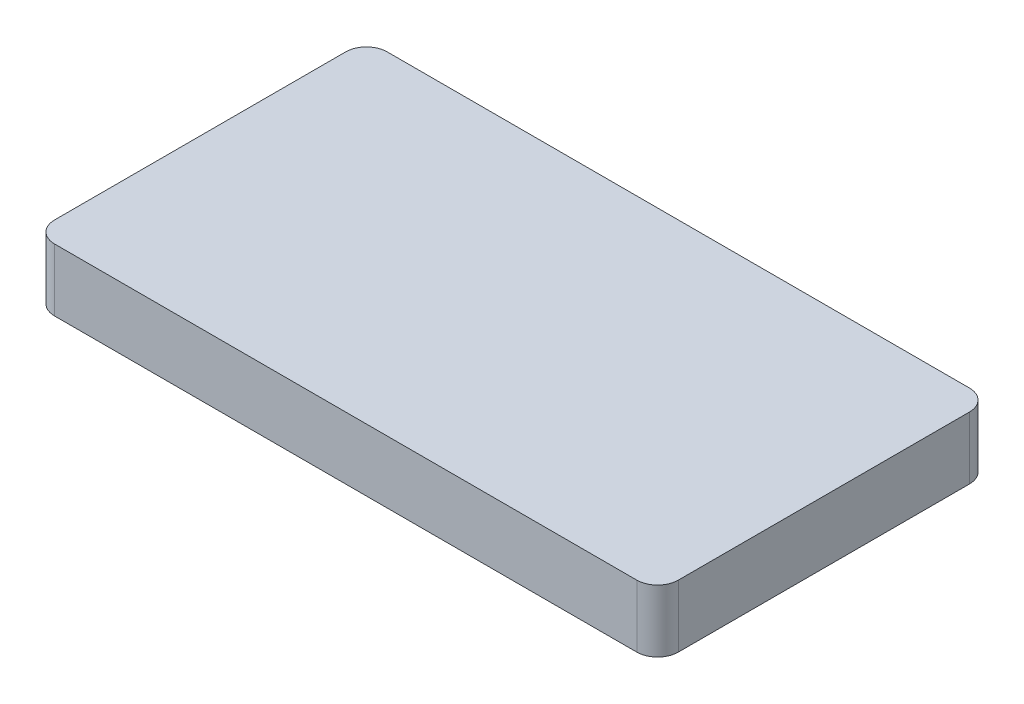
ISO-10303-21;
HEADER;
FILE_DESCRIPTION(('STEP AP214'),'2;1');
FILE_NAME('part.step','',(''),(''),'','','');
FILE_SCHEMA(('AUTOMOTIVE_DESIGN { 1 0 10303 214 1 1 1 1 }'));
ENDSEC;
DATA;
#1=APPLICATION_CONTEXT('core data for automotive mechanical design processes');
#2=APPLICATION_PROTOCOL_DEFINITION('international standard','automotive_design',2000,#1);
#3=PRODUCT_CONTEXT('',#1,'mechanical');
#4=PRODUCT('Part','Part','',(#3));
#5=PRODUCT_RELATED_PRODUCT_CATEGORY('part','',(#4));
#6=PRODUCT_DEFINITION_FORMATION('','',#4);
#7=PRODUCT_DEFINITION_CONTEXT('part definition',#1,'design');
#8=PRODUCT_DEFINITION('design','',#6,#7);
#9=PRODUCT_DEFINITION_SHAPE('','',#8);
#10=(LENGTH_UNIT() NAMED_UNIT(*) SI_UNIT(.MILLI.,.METRE.));
#11=(NAMED_UNIT(*) PLANE_ANGLE_UNIT() SI_UNIT($,.RADIAN.));
#12=(NAMED_UNIT(*) SI_UNIT($,.STERADIAN.) SOLID_ANGLE_UNIT());
#13=UNCERTAINTY_MEASURE_WITH_UNIT(LENGTH_MEASURE(1.E-05),#10,'distance_accuracy_value','');
#14=(GEOMETRIC_REPRESENTATION_CONTEXT(3) GLOBAL_UNCERTAINTY_ASSIGNED_CONTEXT((#13)) GLOBAL_UNIT_ASSIGNED_CONTEXT((#10,
#11,#12)) REPRESENTATION_CONTEXT('',''));
#15=CARTESIAN_POINT('',(0.,0.,0.));
#16=DIRECTION('',(0.,0.,1.));
#17=DIRECTION('',(1.,0.,0.));
#18=AXIS2_PLACEMENT_3D('',#15,#16,#17);
#19=CARTESIAN_POINT('',(75.,7.5,40.));
#20=DIRECTION('',(-1.,0.,0.));
#21=DIRECTION('',(0.,0.,1.));
#22=AXIS2_PLACEMENT_3D('',#19,#20,#21);
#23=PLANE('',#22);
#24=DIRECTION('',(0.,0.,-1.));
#25=VECTOR('',#24,1.);
#26=CARTESIAN_POINT('',(75.,7.5,40.));
#27=LINE('',#26,#25);
#28=CARTESIAN_POINT('',(75.,7.5,35.));
#29=VERTEX_POINT('',#28);
#30=CARTESIAN_POINT('',(75.,7.5,-35.));
#31=VERTEX_POINT('',#30);
#32=EDGE_CURVE('E120',#29,#31,#27,.T.);
#33=ORIENTED_EDGE('',*,*,#32,.F.);
#34=DIRECTION('',(0.,-1.,0.));
#35=VECTOR('',#34,1.);
#36=CARTESIAN_POINT('',(75.,7.5,35.));
#37=LINE('',#36,#35);
#38=CARTESIAN_POINT('',(75.,-7.5,35.));
#39=VERTEX_POINT('',#38);
#40=EDGE_CURVE('E105',#29,#39,#37,.T.);
#41=ORIENTED_EDGE('',*,*,#40,.T.);
#42=DIRECTION('',(0.,0.,-1.));
#43=VECTOR('',#42,1.);
#44=CARTESIAN_POINT('',(75.,-7.5,40.));
#45=LINE('',#44,#43);
#46=CARTESIAN_POINT('',(75.,-7.5,-35.));
#47=VERTEX_POINT('',#46);
#48=EDGE_CURVE('E117',#39,#47,#45,.T.);
#49=ORIENTED_EDGE('',*,*,#48,.T.);
#50=DIRECTION('',(0.,-1.,0.));
#51=VECTOR('',#50,1.);
#52=CARTESIAN_POINT('',(75.,7.5,-35.));
#53=LINE('',#52,#51);
#54=EDGE_CURVE('E122',#47,#31,#53,.F.);
#55=ORIENTED_EDGE('',*,*,#54,.T.);
#56=EDGE_LOOP('',(#33,#41,#49,#55));
#57=FACE_BOUND('',#56,.T.);
#58=ADVANCED_FACE('F36',(#57),#23,.F.);
#59=CARTESIAN_POINT('',(-75.,7.5,-40.));
#60=DIRECTION('',(0.,0.,1.));
#61=DIRECTION('',(1.,0.,0.));
#62=AXIS2_PLACEMENT_3D('',#59,#60,#61);
#63=PLANE('',#62);
#64=DIRECTION('',(-1.,0.,0.));
#65=VECTOR('',#64,1.);
#66=CARTESIAN_POINT('',(-75.,7.5,-40.));
#67=LINE('',#66,#65);
#68=CARTESIAN_POINT('',(70.,7.5,-40.));
#69=VERTEX_POINT('',#68);
#70=CARTESIAN_POINT('',(-70.,7.5,-40.));
#71=VERTEX_POINT('',#70);
#72=EDGE_CURVE('E171',#69,#71,#67,.T.);
#73=ORIENTED_EDGE('',*,*,#72,.F.);
#74=DIRECTION('',(0.,-1.,0.));
#75=VECTOR('',#74,1.);
#76=CARTESIAN_POINT('',(70.,7.5,-40.));
#77=LINE('',#76,#75);
#78=CARTESIAN_POINT('',(70.,-7.5,-40.));
#79=VERTEX_POINT('',#78);
#80=EDGE_CURVE('E155',#69,#79,#77,.T.);
#81=ORIENTED_EDGE('',*,*,#80,.T.);
#82=DIRECTION('',(-1.,0.,0.));
#83=VECTOR('',#82,1.);
#84=CARTESIAN_POINT('',(-75.,-7.5,-40.));
#85=LINE('',#84,#83);
#86=CARTESIAN_POINT('',(-70.,-7.5,-40.));
#87=VERTEX_POINT('',#86);
#88=EDGE_CURVE('E126',#79,#87,#85,.T.);
#89=ORIENTED_EDGE('',*,*,#88,.T.);
#90=DIRECTION('',(0.,-1.,0.));
#91=VECTOR('',#90,1.);
#92=CARTESIAN_POINT('',(-70.,7.5,-40.));
#93=LINE('',#92,#91);
#94=EDGE_CURVE('E153',#87,#71,#93,.F.);
#95=ORIENTED_EDGE('',*,*,#94,.T.);
#96=EDGE_LOOP('',(#73,#81,#89,#95));
#97=FACE_BOUND('',#96,.T.);
#98=ADVANCED_FACE('F181',(#97),#63,.F.);
#99=CARTESIAN_POINT('',(-75.,7.5,40.));
#100=DIRECTION('',(1.,0.,0.));
#101=DIRECTION('',(0.,0.,-1.));
#102=AXIS2_PLACEMENT_3D('',#99,#100,#101);
#103=PLANE('',#102);
#104=DIRECTION('',(0.,0.,1.));
#105=VECTOR('',#104,1.);
#106=CARTESIAN_POINT('',(-75.,-7.5,40.));
#107=LINE('',#106,#105);
#108=CARTESIAN_POINT('',(-75.,-7.5,-35.));
#109=VERTEX_POINT('',#108);
#110=CARTESIAN_POINT('',(-75.,-7.5,35.));
#111=VERTEX_POINT('',#110);
#112=EDGE_CURVE('E129',#109,#111,#107,.T.);
#113=ORIENTED_EDGE('',*,*,#112,.T.);
#114=DIRECTION('',(0.,-1.,0.));
#115=VECTOR('',#114,1.);
#116=CARTESIAN_POINT('',(-75.,7.5,35.));
#117=LINE('',#116,#115);
#118=CARTESIAN_POINT('',(-75.,7.5,35.));
#119=VERTEX_POINT('',#118);
#120=EDGE_CURVE('E11',#111,#119,#117,.F.);
#121=ORIENTED_EDGE('',*,*,#120,.T.);
#122=DIRECTION('',(0.,0.,1.));
#123=VECTOR('',#122,1.);
#124=CARTESIAN_POINT('',(-75.,7.5,40.));
#125=LINE('',#124,#123);
#126=CARTESIAN_POINT('',(-75.,7.5,-35.));
#127=VERTEX_POINT('',#126);
#128=EDGE_CURVE('E161',#127,#119,#125,.T.);
#129=ORIENTED_EDGE('',*,*,#128,.F.);
#130=DIRECTION('',(0.,-1.,0.));
#131=VECTOR('',#130,1.);
#132=CARTESIAN_POINT('',(-75.,7.5,-35.));
#133=LINE('',#132,#131);
#134=EDGE_CURVE('E44',#127,#109,#133,.T.);
#135=ORIENTED_EDGE('',*,*,#134,.T.);
#136=EDGE_LOOP('',(#113,#121,#129,#135));
#137=FACE_BOUND('',#136,.T.);
#138=ADVANCED_FACE('F160',(#137),#103,.F.);
#139=CARTESIAN_POINT('',(-75.,7.5,40.));
#140=DIRECTION('',(0.,0.,-1.));
#141=DIRECTION('',(-1.,0.,0.));
#142=AXIS2_PLACEMENT_3D('',#139,#140,#141);
#143=PLANE('',#142);
#144=DIRECTION('',(1.,0.,0.));
#145=VECTOR('',#144,1.);
#146=CARTESIAN_POINT('',(-75.,-7.5,40.));
#147=LINE('',#146,#145);
#148=CARTESIAN_POINT('',(-70.,-7.5,40.));
#149=VERTEX_POINT('',#148);
#150=CARTESIAN_POINT('',(70.,-7.5,40.));
#151=VERTEX_POINT('',#150);
#152=EDGE_CURVE('E136',#149,#151,#147,.T.);
#153=ORIENTED_EDGE('',*,*,#152,.T.);
#154=DIRECTION('',(0.,-1.,0.));
#155=VECTOR('',#154,1.);
#156=CARTESIAN_POINT('',(70.,7.5,40.));
#157=LINE('',#156,#155);
#158=CARTESIAN_POINT('',(70.,7.5,40.));
#159=VERTEX_POINT('',#158);
#160=EDGE_CURVE('E106',#151,#159,#157,.F.);
#161=ORIENTED_EDGE('',*,*,#160,.T.);
#162=DIRECTION('',(1.,0.,0.));
#163=VECTOR('',#162,1.);
#164=CARTESIAN_POINT('',(-75.,7.5,40.));
#165=LINE('',#164,#163);
#166=CARTESIAN_POINT('',(-70.,7.5,40.));
#167=VERTEX_POINT('',#166);
#168=EDGE_CURVE('E132',#167,#159,#165,.T.);
#169=ORIENTED_EDGE('',*,*,#168,.F.);
#170=DIRECTION('',(0.,-1.,0.));
#171=VECTOR('',#170,1.);
#172=CARTESIAN_POINT('',(-70.,7.5,40.));
#173=LINE('',#172,#171);
#174=EDGE_CURVE('E111',#167,#149,#173,.T.);
#175=ORIENTED_EDGE('',*,*,#174,.T.);
#176=EDGE_LOOP('',(#153,#161,#169,#175));
#177=FACE_BOUND('',#176,.T.);
#178=ADVANCED_FACE('F169',(#177),#143,.F.);
#179=CARTESIAN_POINT('',(0.,7.5,0.));
#180=DIRECTION('',(0.,-1.,0.));
#181=DIRECTION('',(0.,0.,-1.));
#182=AXIS2_PLACEMENT_3D('',#179,#180,#181);
#183=PLANE('',#182);
#184=ORIENTED_EDGE('',*,*,#168,.T.);
#185=CARTESIAN_POINT('',(70.,7.5,35.));
#186=DIRECTION('',(0.,-1.,0.));
#187=DIRECTION('',(0.,0.,-1.));
#188=AXIS2_PLACEMENT_3D('',#185,#186,#187);
#189=CIRCLE('',#188,5.);
#190=EDGE_CURVE('E151',#159,#29,#189,.F.);
#191=ORIENTED_EDGE('',*,*,#190,.T.);
#192=ORIENTED_EDGE('',*,*,#32,.T.);
#193=CARTESIAN_POINT('',(70.,7.5,-35.));
#194=DIRECTION('',(0.,-1.,0.));
#195=DIRECTION('',(0.,0.,-1.));
#196=AXIS2_PLACEMENT_3D('',#193,#194,#195);
#197=CIRCLE('',#196,5.);
#198=EDGE_CURVE('E149',#31,#69,#197,.F.);
#199=ORIENTED_EDGE('',*,*,#198,.T.);
#200=ORIENTED_EDGE('',*,*,#72,.T.);
#201=CARTESIAN_POINT('',(-70.,7.5,-35.));
#202=DIRECTION('',(0.,-1.,0.));
#203=DIRECTION('',(0.,0.,-1.));
#204=AXIS2_PLACEMENT_3D('',#201,#202,#203);
#205=CIRCLE('',#204,5.);
#206=EDGE_CURVE('E56',#71,#127,#205,.F.);
#207=ORIENTED_EDGE('',*,*,#206,.T.);
#208=ORIENTED_EDGE('',*,*,#128,.T.);
#209=CARTESIAN_POINT('',(-70.,7.5,35.));
#210=DIRECTION('',(0.,-1.,0.));
#211=DIRECTION('',(0.,0.,-1.));
#212=AXIS2_PLACEMENT_3D('',#209,#210,#211);
#213=CIRCLE('',#212,5.);
#214=EDGE_CURVE('E147',#119,#167,#213,.F.);
#215=ORIENTED_EDGE('',*,*,#214,.T.);
#216=EDGE_LOOP('',(#184,#191,#192,#199,#200,#207,#208,#215));
#217=FACE_BOUND('',#216,.T.);
#218=ADVANCED_FACE('F175',(#217),#183,.F.);
#219=CARTESIAN_POINT('',(0.,-7.5,0.));
#220=DIRECTION('',(0.,-1.,0.));
#221=DIRECTION('',(0.,0.,-1.));
#222=AXIS2_PLACEMENT_3D('',#219,#220,#221);
#223=PLANE('',#222);
#224=ORIENTED_EDGE('',*,*,#48,.F.);
#225=CARTESIAN_POINT('',(70.,-7.5,35.));
#226=DIRECTION('',(0.,-1.,0.));
#227=DIRECTION('',(0.,0.,-1.));
#228=AXIS2_PLACEMENT_3D('',#225,#226,#227);
#229=CIRCLE('',#228,5.);
#230=EDGE_CURVE('E101',#39,#151,#229,.T.);
#231=ORIENTED_EDGE('',*,*,#230,.T.);
#232=ORIENTED_EDGE('',*,*,#152,.F.);
#233=CARTESIAN_POINT('',(-70.,-7.5,35.));
#234=DIRECTION('',(0.,-1.,0.));
#235=DIRECTION('',(0.,0.,-1.));
#236=AXIS2_PLACEMENT_3D('',#233,#234,#235);
#237=CIRCLE('',#236,5.);
#238=EDGE_CURVE('E140',#149,#111,#237,.T.);
#239=ORIENTED_EDGE('',*,*,#238,.T.);
#240=ORIENTED_EDGE('',*,*,#112,.F.);
#241=CARTESIAN_POINT('',(-70.,-7.5,-35.));
#242=DIRECTION('',(0.,-1.,0.));
#243=DIRECTION('',(0.,0.,-1.));
#244=AXIS2_PLACEMENT_3D('',#241,#242,#243);
#245=CIRCLE('',#244,5.);
#246=EDGE_CURVE('E121',#109,#87,#245,.T.);
#247=ORIENTED_EDGE('',*,*,#246,.T.);
#248=ORIENTED_EDGE('',*,*,#88,.F.);
#249=CARTESIAN_POINT('',(70.,-7.5,-35.));
#250=DIRECTION('',(0.,-1.,0.));
#251=DIRECTION('',(0.,0.,-1.));
#252=AXIS2_PLACEMENT_3D('',#249,#250,#251);
#253=CIRCLE('',#252,5.);
#254=EDGE_CURVE('E112',#79,#47,#253,.T.);
#255=ORIENTED_EDGE('',*,*,#254,.T.);
#256=EDGE_LOOP('',(#224,#231,#232,#239,#240,#247,#248,#255));
#257=FACE_BOUND('',#256,.T.);
#258=ADVANCED_FACE('F124',(#257),#223,.T.);
#259=CARTESIAN_POINT('',(70.,7.5,35.));
#260=DIRECTION('',(0.,-1.,0.));
#261=DIRECTION('',(0.,0.,-1.));
#262=AXIS2_PLACEMENT_3D('',#259,#260,#261);
#263=CYLINDRICAL_SURFACE('',#262,5.);
#264=ORIENTED_EDGE('',*,*,#190,.F.);
#265=ORIENTED_EDGE('',*,*,#160,.F.);
#266=ORIENTED_EDGE('',*,*,#230,.F.);
#267=ORIENTED_EDGE('',*,*,#40,.F.);
#268=EDGE_LOOP('',(#264,#265,#266,#267));
#269=FACE_BOUND('',#268,.T.);
#270=ADVANCED_FACE('F104',(#269),#263,.T.);
#271=CARTESIAN_POINT('',(70.,7.5,-35.));
#272=DIRECTION('',(0.,-1.,0.));
#273=DIRECTION('',(0.,0.,-1.));
#274=AXIS2_PLACEMENT_3D('',#271,#272,#273);
#275=CYLINDRICAL_SURFACE('',#274,5.);
#276=ORIENTED_EDGE('',*,*,#198,.F.);
#277=ORIENTED_EDGE('',*,*,#54,.F.);
#278=ORIENTED_EDGE('',*,*,#254,.F.);
#279=ORIENTED_EDGE('',*,*,#80,.F.);
#280=EDGE_LOOP('',(#276,#277,#278,#279));
#281=FACE_BOUND('',#280,.T.);
#282=ADVANCED_FACE('F179',(#281),#275,.T.);
#283=CARTESIAN_POINT('',(-70.,7.5,35.));
#284=DIRECTION('',(0.,-1.,0.));
#285=DIRECTION('',(0.,0.,-1.));
#286=AXIS2_PLACEMENT_3D('',#283,#284,#285);
#287=CYLINDRICAL_SURFACE('',#286,5.);
#288=ORIENTED_EDGE('',*,*,#214,.F.);
#289=ORIENTED_EDGE('',*,*,#120,.F.);
#290=ORIENTED_EDGE('',*,*,#238,.F.);
#291=ORIENTED_EDGE('',*,*,#174,.F.);
#292=EDGE_LOOP('',(#288,#289,#290,#291));
#293=FACE_BOUND('',#292,.T.);
#294=ADVANCED_FACE('F166',(#293),#287,.T.);
#295=CARTESIAN_POINT('',(-70.,7.5,-35.));
#296=DIRECTION('',(0.,-1.,0.));
#297=DIRECTION('',(0.,0.,-1.));
#298=AXIS2_PLACEMENT_3D('',#295,#296,#297);
#299=CYLINDRICAL_SURFACE('',#298,5.);
#300=ORIENTED_EDGE('',*,*,#206,.F.);
#301=ORIENTED_EDGE('',*,*,#94,.F.);
#302=ORIENTED_EDGE('',*,*,#246,.F.);
#303=ORIENTED_EDGE('',*,*,#134,.F.);
#304=EDGE_LOOP('',(#300,#301,#302,#303));
#305=FACE_BOUND('',#304,.T.);
#306=ADVANCED_FACE('F38',(#305),#299,.T.);
#307=CLOSED_SHELL('',(#58,#98,#138,#178,#218,#258,#270,#282,#294,#306));
#308=MANIFOLD_SOLID_BREP('B2',#307);
#309=ADVANCED_BREP_SHAPE_REPRESENTATION('',(#18,#308),#14);
#310=SHAPE_DEFINITION_REPRESENTATION(#9,#309);
ENDSEC;
END-ISO-10303-21;
